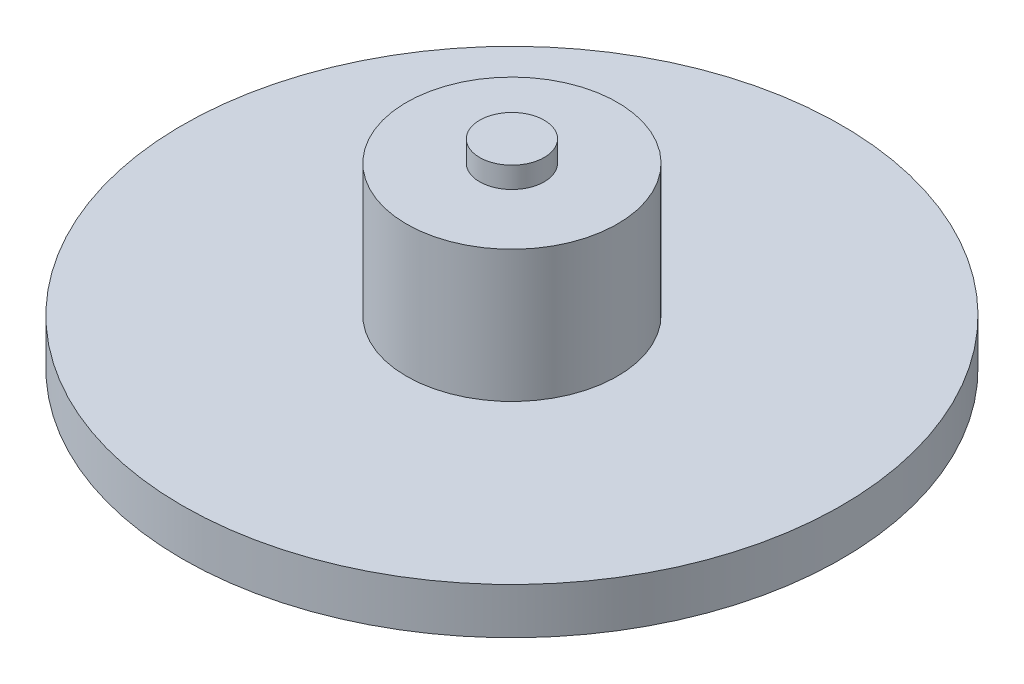
ISO-10303-21;
HEADER;
FILE_DESCRIPTION(('STEP AP214'),'2;1');
FILE_NAME('part.step','',(''),(''),'','','');
FILE_SCHEMA(('AUTOMOTIVE_DESIGN { 1 0 10303 214 1 1 1 1 }'));
ENDSEC;
DATA;
#1=APPLICATION_CONTEXT('core data for automotive mechanical design processes');
#2=APPLICATION_PROTOCOL_DEFINITION('international standard','automotive_design',2000,#1);
#3=PRODUCT_CONTEXT('',#1,'mechanical');
#4=PRODUCT('Part','Part','',(#3));
#5=PRODUCT_RELATED_PRODUCT_CATEGORY('part','',(#4));
#6=PRODUCT_DEFINITION_FORMATION('','',#4);
#7=PRODUCT_DEFINITION_CONTEXT('part definition',#1,'design');
#8=PRODUCT_DEFINITION('design','',#6,#7);
#9=PRODUCT_DEFINITION_SHAPE('','',#8);
#10=(LENGTH_UNIT() NAMED_UNIT(*) SI_UNIT(.MILLI.,.METRE.));
#11=(NAMED_UNIT(*) PLANE_ANGLE_UNIT() SI_UNIT($,.RADIAN.));
#12=(NAMED_UNIT(*) SI_UNIT($,.STERADIAN.) SOLID_ANGLE_UNIT());
#13=UNCERTAINTY_MEASURE_WITH_UNIT(LENGTH_MEASURE(1.E-05),#10,'distance_accuracy_value','');
#14=(GEOMETRIC_REPRESENTATION_CONTEXT(3) GLOBAL_UNCERTAINTY_ASSIGNED_CONTEXT((#13)) GLOBAL_UNIT_ASSIGNED_CONTEXT((#10,
#11,#12)) REPRESENTATION_CONTEXT('',''));
#15=CARTESIAN_POINT('',(0.,0.,0.));
#16=DIRECTION('',(0.,0.,1.));
#17=DIRECTION('',(1.,0.,0.));
#18=AXIS2_PLACEMENT_3D('',#15,#16,#17);
#19=CARTESIAN_POINT('',(0.,3.5,0.));
#20=DIRECTION('',(0.,-1.,0.));
#21=DIRECTION('',(0.,0.,-1.));
#22=AXIS2_PLACEMENT_3D('',#19,#20,#21);
#23=CYLINDRICAL_SURFACE('',#22,25.);
#24=CARTESIAN_POINT('',(0.,3.5,0.));
#25=DIRECTION('',(0.,1.,0.));
#26=DIRECTION('',(0.,0.,1.));
#27=AXIS2_PLACEMENT_3D('',#24,#25,#26);
#28=CIRCLE('',#27,25.);
#29=CARTESIAN_POINT('',(0.,3.5,25.));
#30=VERTEX_POINT('',#29);
#31=EDGE_CURVE('E51',#30,#30,#28,.T.);
#32=ORIENTED_EDGE('',*,*,#31,.F.);
#33=EDGE_LOOP('',(#32));
#34=FACE_BOUND('',#33,.T.);
#35=CARTESIAN_POINT('',(0.,0.,0.));
#36=DIRECTION('',(0.,1.,0.));
#37=DIRECTION('',(0.,0.,1.));
#38=AXIS2_PLACEMENT_3D('',#35,#36,#37);
#39=CIRCLE('',#38,25.);
#40=CARTESIAN_POINT('',(0.,0.,25.));
#41=VERTEX_POINT('',#40);
#42=EDGE_CURVE('E40',#41,#41,#39,.T.);
#43=ORIENTED_EDGE('',*,*,#42,.T.);
#44=EDGE_LOOP('',(#43));
#45=FACE_BOUND('',#44,.T.);
#46=ADVANCED_FACE('F37',(#34,#45),#23,.T.);
#47=CARTESIAN_POINT('',(0.,3.5,0.));
#48=DIRECTION('',(0.,1.,0.));
#49=DIRECTION('',(0.,0.,1.));
#50=AXIS2_PLACEMENT_3D('',#47,#48,#49);
#51=PLANE('',#50);
#52=CARTESIAN_POINT('',(0.,3.5,0.));
#53=DIRECTION('',(0.,1.,0.));
#54=DIRECTION('',(0.,0.,1.));
#55=AXIS2_PLACEMENT_3D('',#52,#53,#54);
#56=CIRCLE('',#55,8.);
#57=CARTESIAN_POINT('',(0.,3.5,8.));
#58=VERTEX_POINT('',#57);
#59=EDGE_CURVE('E45',#58,#58,#56,.T.);
#60=ORIENTED_EDGE('',*,*,#59,.F.);
#61=EDGE_LOOP('',(#60));
#62=FACE_BOUND('',#61,.T.);
#63=ORIENTED_EDGE('',*,*,#31,.T.);
#64=EDGE_LOOP('',(#63));
#65=FACE_BOUND('',#64,.T.);
#66=ADVANCED_FACE('F71',(#62,#65),#51,.T.);
#67=CARTESIAN_POINT('',(0.,0.,0.));
#68=DIRECTION('',(0.,1.,0.));
#69=DIRECTION('',(0.,0.,1.));
#70=AXIS2_PLACEMENT_3D('',#67,#68,#69);
#71=PLANE('',#70);
#72=ORIENTED_EDGE('',*,*,#42,.F.);
#73=EDGE_LOOP('',(#72));
#74=FACE_BOUND('',#73,.T.);
#75=ADVANCED_FACE('F68',(#74),#71,.F.);
#76=CARTESIAN_POINT('',(0.,13.5,0.));
#77=DIRECTION('',(0.,-1.,0.));
#78=DIRECTION('',(0.,0.,-1.));
#79=AXIS2_PLACEMENT_3D('',#76,#77,#78);
#80=CYLINDRICAL_SURFACE('',#79,8.);
#81=CARTESIAN_POINT('',(0.,13.5,0.));
#82=DIRECTION('',(0.,1.,0.));
#83=DIRECTION('',(0.,0.,1.));
#84=AXIS2_PLACEMENT_3D('',#81,#82,#83);
#85=CIRCLE('',#84,8.);
#86=CARTESIAN_POINT('',(0.,13.5,8.));
#87=VERTEX_POINT('',#86);
#88=EDGE_CURVE('E56',#87,#87,#85,.T.);
#89=ORIENTED_EDGE('',*,*,#88,.F.);
#90=EDGE_LOOP('',(#89));
#91=FACE_BOUND('',#90,.T.);
#92=ORIENTED_EDGE('',*,*,#59,.T.);
#93=EDGE_LOOP('',(#92));
#94=FACE_BOUND('',#93,.T.);
#95=ADVANCED_FACE('F70',(#91,#94),#80,.T.);
#96=CARTESIAN_POINT('',(0.,13.5,0.));
#97=DIRECTION('',(0.,1.,0.));
#98=DIRECTION('',(0.,0.,1.));
#99=AXIS2_PLACEMENT_3D('',#96,#97,#98);
#100=PLANE('',#99);
#101=CARTESIAN_POINT('',(0.,13.5,0.));
#102=DIRECTION('',(0.,1.,0.));
#103=DIRECTION('',(0.,0.,1.));
#104=AXIS2_PLACEMENT_3D('',#101,#102,#103);
#105=CIRCLE('',#104,2.45);
#106=CARTESIAN_POINT('',(0.,13.5,2.45));
#107=VERTEX_POINT('',#106);
#108=EDGE_CURVE('E10',#107,#107,#105,.T.);
#109=ORIENTED_EDGE('',*,*,#108,.F.);
#110=EDGE_LOOP('',(#109));
#111=FACE_BOUND('',#110,.T.);
#112=ORIENTED_EDGE('',*,*,#88,.T.);
#113=EDGE_LOOP('',(#112));
#114=FACE_BOUND('',#113,.T.);
#115=ADVANCED_FACE('F76',(#111,#114),#100,.T.);
#116=CARTESIAN_POINT('',(0.,15.1,0.));
#117=DIRECTION('',(0.,-1.,0.));
#118=DIRECTION('',(0.,0.,-1.));
#119=AXIS2_PLACEMENT_3D('',#116,#117,#118);
#120=CYLINDRICAL_SURFACE('',#119,2.45);
#121=CARTESIAN_POINT('',(0.,15.1,0.));
#122=DIRECTION('',(0.,1.,0.));
#123=DIRECTION('',(0.,0.,1.));
#124=AXIS2_PLACEMENT_3D('',#121,#122,#123);
#125=CIRCLE('',#124,2.45);
#126=CARTESIAN_POINT('',(0.,15.1,2.45));
#127=VERTEX_POINT('',#126);
#128=EDGE_CURVE('E55',#127,#127,#125,.T.);
#129=ORIENTED_EDGE('',*,*,#128,.F.);
#130=EDGE_LOOP('',(#129));
#131=FACE_BOUND('',#130,.T.);
#132=ORIENTED_EDGE('',*,*,#108,.T.);
#133=EDGE_LOOP('',(#132));
#134=FACE_BOUND('',#133,.T.);
#135=ADVANCED_FACE('F106',(#131,#134),#120,.T.);
#136=CARTESIAN_POINT('',(0.,15.1,0.));
#137=DIRECTION('',(0.,1.,0.));
#138=DIRECTION('',(0.,0.,1.));
#139=AXIS2_PLACEMENT_3D('',#136,#137,#138);
#140=PLANE('',#139);
#141=ORIENTED_EDGE('',*,*,#128,.T.);
#142=EDGE_LOOP('',(#141));
#143=FACE_BOUND('',#142,.T.);
#144=ADVANCED_FACE('F116',(#143),#140,.T.);
#145=CLOSED_SHELL('',(#46,#66,#75,#95,#115,#135,#144));
#146=MANIFOLD_SOLID_BREP('B2',#145);
#147=ADVANCED_BREP_SHAPE_REPRESENTATION('',(#18,#146),#14);
#148=SHAPE_DEFINITION_REPRESENTATION(#9,#147);
ENDSEC;
END-ISO-10303-21;
